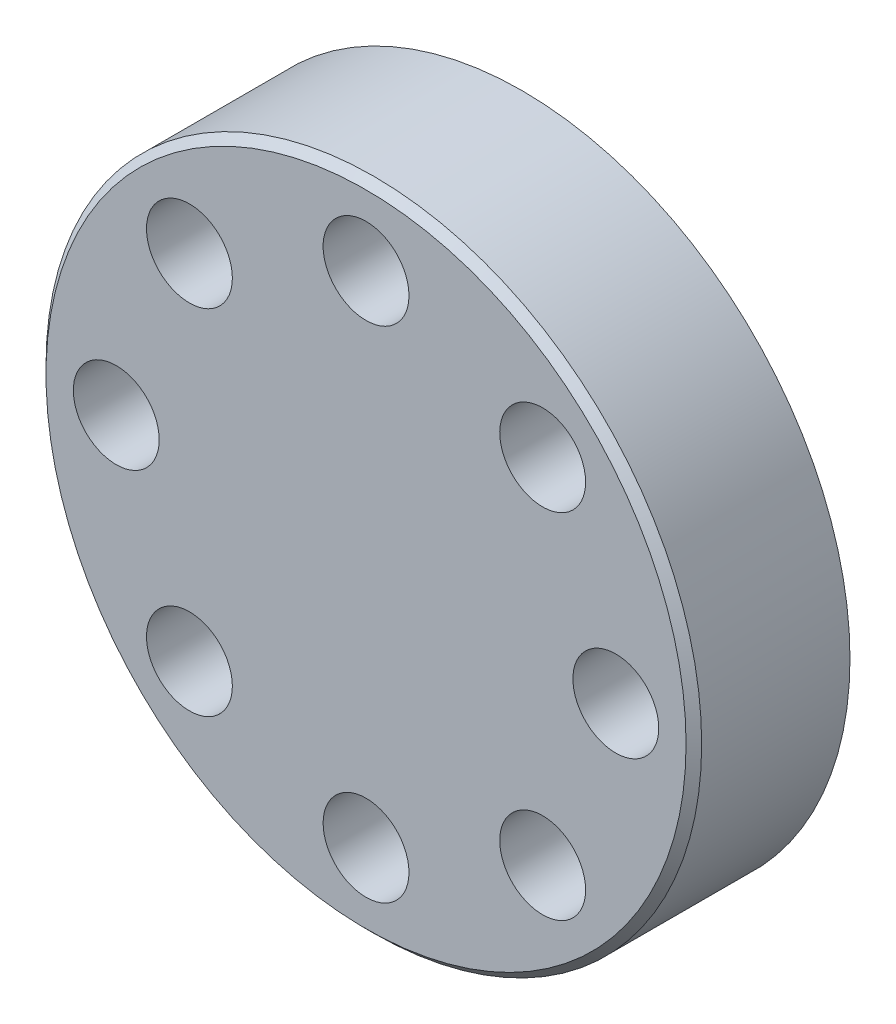
ISO-10303-21;
HEADER;
FILE_DESCRIPTION(('STEP AP214'),'2;1');
FILE_NAME('part.step','',(''),(''),'','','');
FILE_SCHEMA(('AUTOMOTIVE_DESIGN { 1 0 10303 214 1 1 1 1 }'));
ENDSEC;
DATA;
#1=APPLICATION_CONTEXT('core data for automotive mechanical design processes');
#2=APPLICATION_PROTOCOL_DEFINITION('international standard','automotive_design',2000,#1);
#3=PRODUCT_CONTEXT('',#1,'mechanical');
#4=PRODUCT('Part','Part','',(#3));
#5=PRODUCT_RELATED_PRODUCT_CATEGORY('part','',(#4));
#6=PRODUCT_DEFINITION_FORMATION('','',#4);
#7=PRODUCT_DEFINITION_CONTEXT('part definition',#1,'design');
#8=PRODUCT_DEFINITION('design','',#6,#7);
#9=PRODUCT_DEFINITION_SHAPE('','',#8);
#10=(LENGTH_UNIT() NAMED_UNIT(*) SI_UNIT(.MILLI.,.METRE.));
#11=(NAMED_UNIT(*) PLANE_ANGLE_UNIT() SI_UNIT($,.RADIAN.));
#12=(NAMED_UNIT(*) SI_UNIT($,.STERADIAN.) SOLID_ANGLE_UNIT());
#13=UNCERTAINTY_MEASURE_WITH_UNIT(LENGTH_MEASURE(1.E-05),#10,'distance_accuracy_value','');
#14=(GEOMETRIC_REPRESENTATION_CONTEXT(3) GLOBAL_UNCERTAINTY_ASSIGNED_CONTEXT((#13)) GLOBAL_UNIT_ASSIGNED_CONTEXT((#10,
#11,#12)) REPRESENTATION_CONTEXT('',''));
#15=CARTESIAN_POINT('',(0.,0.,0.));
#16=DIRECTION('',(0.,0.,1.));
#17=DIRECTION('',(1.,0.,0.));
#18=AXIS2_PLACEMENT_3D('',#15,#16,#17);
#19=CARTESIAN_POINT('',(0.,0.,8.));
#20=DIRECTION('',(0.,0.,-1.));
#21=DIRECTION('',(-1.,0.,0.));
#22=AXIS2_PLACEMENT_3D('',#19,#20,#21);
#23=CYLINDRICAL_SURFACE('',#22,7.);
#24=CARTESIAN_POINT('',(0.,0.,0.499999999999998));
#25=DIRECTION('',(0.,0.,1.));
#26=DIRECTION('',(1.,0.,0.));
#27=AXIS2_PLACEMENT_3D('',#24,#25,#26);
#28=CIRCLE('',#27,7.);
#29=CARTESIAN_POINT('',(7.,0.,0.499999999999998));
#30=VERTEX_POINT('',#29);
#31=EDGE_CURVE('E52',#30,#30,#28,.T.);
#32=ORIENTED_EDGE('',*,*,#31,.T.);
#33=EDGE_LOOP('',(#32));
#34=FACE_BOUND('',#33,.T.);
#35=CARTESIAN_POINT('',(0.,0.,8.));
#36=DIRECTION('',(0.,0.,1.));
#37=DIRECTION('',(1.,0.,0.));
#38=AXIS2_PLACEMENT_3D('',#35,#36,#37);
#39=CIRCLE('',#38,7.);
#40=CARTESIAN_POINT('',(7.,0.,8.));
#41=VERTEX_POINT('',#40);
#42=EDGE_CURVE('E57',#41,#41,#39,.T.);
#43=ORIENTED_EDGE('',*,*,#42,.F.);
#44=EDGE_LOOP('',(#43));
#45=FACE_BOUND('',#44,.T.);
#46=ADVANCED_FACE('F36',(#34,#45),#23,.T.);
#47=CARTESIAN_POINT('',(0.,0.,0.));
#48=DIRECTION('',(0.,0.,1.));
#49=DIRECTION('',(1.,0.,0.));
#50=AXIS2_PLACEMENT_3D('',#47,#48,#49);
#51=PLANE('',#50);
#52=CARTESIAN_POINT('',(0.,0.,0.));
#53=DIRECTION('',(0.,0.,1.));
#54=DIRECTION('',(1.,0.,0.));
#55=AXIS2_PLACEMENT_3D('',#52,#53,#54);
#56=CIRCLE('',#55,6.5);
#57=CARTESIAN_POINT('',(6.5,0.,0.));
#58=VERTEX_POINT('',#57);
#59=EDGE_CURVE('E48',#58,#58,#56,.F.);
#60=ORIENTED_EDGE('',*,*,#59,.T.);
#61=EDGE_LOOP('',(#60));
#62=FACE_BOUND('',#61,.T.);
#63=ADVANCED_FACE('F143',(#62),#51,.F.);
#64=CARTESIAN_POINT('',(0.,0.,18.));
#65=DIRECTION('',(0.,0.,-1.));
#66=DIRECTION('',(-1.,0.,0.));
#67=AXIS2_PLACEMENT_3D('',#64,#65,#66);
#68=CYLINDRICAL_SURFACE('',#67,21.);
#69=CARTESIAN_POINT('',(0.,0.,17.5));
#70=DIRECTION('',(0.,0.,1.));
#71=DIRECTION('',(1.,0.,0.));
#72=AXIS2_PLACEMENT_3D('',#69,#70,#71);
#73=CIRCLE('',#72,21.);
#74=CARTESIAN_POINT('',(21.,0.,17.5));
#75=VERTEX_POINT('',#74);
#76=EDGE_CURVE('E10',#75,#75,#73,.F.);
#77=ORIENTED_EDGE('',*,*,#76,.T.);
#78=EDGE_LOOP('',(#77));
#79=FACE_BOUND('',#78,.T.);
#80=CARTESIAN_POINT('',(0.,0.,8.));
#81=DIRECTION('',(0.,0.,1.));
#82=DIRECTION('',(1.,0.,0.));
#83=AXIS2_PLACEMENT_3D('',#80,#81,#82);
#84=CIRCLE('',#83,21.);
#85=CARTESIAN_POINT('',(21.,0.,8.));
#86=VERTEX_POINT('',#85);
#87=EDGE_CURVE('E84',#86,#86,#84,.T.);
#88=ORIENTED_EDGE('',*,*,#87,.T.);
#89=EDGE_LOOP('',(#88));
#90=FACE_BOUND('',#89,.T.);
#91=ADVANCED_FACE('F119',(#79,#90),#68,.T.);
#92=CARTESIAN_POINT('',(0.,0.,18.));
#93=DIRECTION('',(0.,0.,1.));
#94=DIRECTION('',(1.,0.,0.));
#95=AXIS2_PLACEMENT_3D('',#92,#93,#94);
#96=PLANE('',#95);
#97=CARTESIAN_POINT('',(0.,0.,18.));
#98=DIRECTION('',(0.,0.,1.));
#99=DIRECTION('',(1.,0.,0.));
#100=AXIS2_PLACEMENT_3D('',#97,#98,#99);
#101=CIRCLE('',#100,20.5);
#102=CARTESIAN_POINT('',(20.5,0.,18.));
#103=VERTEX_POINT('',#102);
#104=EDGE_CURVE('E44',#103,#103,#101,.T.);
#105=ORIENTED_EDGE('',*,*,#104,.T.);
#106=EDGE_LOOP('',(#105));
#107=FACE_BOUND('',#106,.T.);
#108=CARTESIAN_POINT('',(-16.,0.,18.));
#109=DIRECTION('',(0.,0.,1.));
#110=DIRECTION('',(0.,1.,0.));
#111=AXIS2_PLACEMENT_3D('',#108,#109,#110);
#112=CIRCLE('',#111,2.75);
#113=CARTESIAN_POINT('',(-16.,2.74999999999994,18.));
#114=VERTEX_POINT('',#113);
#115=EDGE_CURVE('E93',#114,#114,#112,.T.);
#116=ORIENTED_EDGE('',*,*,#115,.F.);
#117=EDGE_LOOP('',(#116));
#118=FACE_BOUND('',#117,.T.);
#119=CARTESIAN_POINT('',(-11.3137084989847,-11.3137084989848,18.));
#120=DIRECTION('',(0.,0.,1.));
#121=DIRECTION('',(-0.707106781186551,0.707106781186544,0.));
#122=AXIS2_PLACEMENT_3D('',#119,#120,#121);
#123=CIRCLE('',#122,2.75);
#124=CARTESIAN_POINT('',(-13.2582521472477,-9.36916485072182,18.));
#125=VERTEX_POINT('',#124);
#126=EDGE_CURVE('E101',#125,#125,#123,.T.);
#127=ORIENTED_EDGE('',*,*,#126,.F.);
#128=EDGE_LOOP('',(#127));
#129=FACE_BOUND('',#128,.T.);
#130=CARTESIAN_POINT('',(0.,-16.,18.));
#131=DIRECTION('',(0.,0.,1.));
#132=DIRECTION('',(-1.,0.,0.));
#133=AXIS2_PLACEMENT_3D('',#130,#131,#132);
#134=CIRCLE('',#133,2.75);
#135=CARTESIAN_POINT('',(-2.75,-16.,18.));
#136=VERTEX_POINT('',#135);
#137=EDGE_CURVE('E97',#136,#136,#134,.T.);
#138=ORIENTED_EDGE('',*,*,#137,.F.);
#139=EDGE_LOOP('',(#138));
#140=FACE_BOUND('',#139,.T.);
#141=CARTESIAN_POINT('',(11.3137084989849,-11.3137084989847,18.));
#142=DIRECTION('',(0.,0.,1.));
#143=DIRECTION('',(-0.707106781186541,-0.707106781186554,0.));
#144=AXIS2_PLACEMENT_3D('',#141,#142,#143);
#145=CIRCLE('',#144,2.75);
#146=CARTESIAN_POINT('',(9.36916485072187,-13.2582521472477,18.));
#147=VERTEX_POINT('',#146);
#148=EDGE_CURVE('E94',#147,#147,#145,.T.);
#149=ORIENTED_EDGE('',*,*,#148,.F.);
#150=EDGE_LOOP('',(#149));
#151=FACE_BOUND('',#150,.T.);
#152=CARTESIAN_POINT('',(16.,1.6759110426447E-13,18.));
#153=DIRECTION('',(0.,0.,1.));
#154=DIRECTION('',(0.,-1.,0.));
#155=AXIS2_PLACEMENT_3D('',#152,#153,#154);
#156=CIRCLE('',#155,2.75);
#157=CARTESIAN_POINT('',(16.,-2.74999999999983,18.));
#158=VERTEX_POINT('',#157);
#159=EDGE_CURVE('E98',#158,#158,#156,.T.);
#160=ORIENTED_EDGE('',*,*,#159,.F.);
#161=EDGE_LOOP('',(#160));
#162=FACE_BOUND('',#161,.T.);
#163=CARTESIAN_POINT('',(11.3137084989846,11.3137084989849,18.));
#164=DIRECTION('',(0.,0.,1.));
#165=DIRECTION('',(0.707106781186556,-0.707106781186539,0.));
#166=AXIS2_PLACEMENT_3D('',#163,#164,#165);
#167=CIRCLE('',#166,2.75);
#168=CARTESIAN_POINT('',(13.2582521472477,9.36916485072192,18.));
#169=VERTEX_POINT('',#168);
#170=EDGE_CURVE('E106',#169,#169,#167,.T.);
#171=ORIENTED_EDGE('',*,*,#170,.F.);
#172=EDGE_LOOP('',(#171));
#173=FACE_BOUND('',#172,.T.);
#174=CARTESIAN_POINT('',(-11.3137084989848,11.3137084989847,18.));
#175=DIRECTION('',(0.,0.,1.));
#176=DIRECTION('',(0.707106781186546,0.707106781186549,0.));
#177=AXIS2_PLACEMENT_3D('',#174,#175,#176);
#178=CIRCLE('',#177,2.75);
#179=CARTESIAN_POINT('',(-9.36916485072178,13.2582521472478,18.));
#180=VERTEX_POINT('',#179);
#181=EDGE_CURVE('E80',#180,#180,#178,.T.);
#182=ORIENTED_EDGE('',*,*,#181,.F.);
#183=EDGE_LOOP('',(#182));
#184=FACE_BOUND('',#183,.T.);
#185=CARTESIAN_POINT('',(0.,16.,18.));
#186=DIRECTION('',(0.,0.,1.));
#187=DIRECTION('',(1.,0.,0.));
#188=AXIS2_PLACEMENT_3D('',#185,#186,#187);
#189=CIRCLE('',#188,2.75);
#190=CARTESIAN_POINT('',(2.75,16.,18.));
#191=VERTEX_POINT('',#190);
#192=EDGE_CURVE('E61',#191,#191,#189,.T.);
#193=ORIENTED_EDGE('',*,*,#192,.F.);
#194=EDGE_LOOP('',(#193));
#195=FACE_BOUND('',#194,.T.);
#196=ADVANCED_FACE('F115',(#107,#118,#129,#140,#151,#162,#173,#184,#195),#96,.T.);
#197=CARTESIAN_POINT('',(0.,0.,8.));
#198=DIRECTION('',(0.,0.,1.));
#199=DIRECTION('',(1.,0.,0.));
#200=AXIS2_PLACEMENT_3D('',#197,#198,#199);
#201=PLANE('',#200);
#202=CARTESIAN_POINT('',(-16.,0.,8.));
#203=DIRECTION('',(0.,0.,1.));
#204=DIRECTION('',(1.,0.,0.));
#205=AXIS2_PLACEMENT_3D('',#202,#203,#204);
#206=CIRCLE('',#205,2.75);
#207=CARTESIAN_POINT('',(-13.25,0.,8.));
#208=VERTEX_POINT('',#207);
#209=EDGE_CURVE('E58',#208,#208,#206,.T.);
#210=ORIENTED_EDGE('',*,*,#209,.T.);
#211=EDGE_LOOP('',(#210));
#212=FACE_BOUND('',#211,.T.);
#213=CARTESIAN_POINT('',(-11.3137084989847,-11.3137084989848,8.));
#214=DIRECTION('',(0.,0.,1.));
#215=DIRECTION('',(1.,0.,0.));
#216=AXIS2_PLACEMENT_3D('',#213,#214,#215);
#217=CIRCLE('',#216,2.75);
#218=CARTESIAN_POINT('',(-8.5637084989847,-11.3137084989848,8.));
#219=VERTEX_POINT('',#218);
#220=EDGE_CURVE('E62',#219,#219,#217,.T.);
#221=ORIENTED_EDGE('',*,*,#220,.T.);
#222=EDGE_LOOP('',(#221));
#223=FACE_BOUND('',#222,.T.);
#224=CARTESIAN_POINT('',(0.,-16.,8.));
#225=DIRECTION('',(0.,0.,1.));
#226=DIRECTION('',(1.,0.,0.));
#227=AXIS2_PLACEMENT_3D('',#224,#225,#226);
#228=CIRCLE('',#227,2.75);
#229=CARTESIAN_POINT('',(2.75,-16.,8.));
#230=VERTEX_POINT('',#229);
#231=EDGE_CURVE('E65',#230,#230,#228,.T.);
#232=ORIENTED_EDGE('',*,*,#231,.T.);
#233=EDGE_LOOP('',(#232));
#234=FACE_BOUND('',#233,.T.);
#235=CARTESIAN_POINT('',(11.3137084989849,-11.3137084989847,8.));
#236=DIRECTION('',(0.,0.,1.));
#237=DIRECTION('',(1.,0.,0.));
#238=AXIS2_PLACEMENT_3D('',#235,#236,#237);
#239=CIRCLE('',#238,2.75);
#240=CARTESIAN_POINT('',(14.0637084989849,-11.3137084989847,8.));
#241=VERTEX_POINT('',#240);
#242=EDGE_CURVE('E68',#241,#241,#239,.T.);
#243=ORIENTED_EDGE('',*,*,#242,.T.);
#244=EDGE_LOOP('',(#243));
#245=FACE_BOUND('',#244,.T.);
#246=CARTESIAN_POINT('',(16.,1.6759110426447E-13,8.));
#247=DIRECTION('',(0.,0.,1.));
#248=DIRECTION('',(1.,0.,0.));
#249=AXIS2_PLACEMENT_3D('',#246,#247,#248);
#250=CIRCLE('',#249,2.75);
#251=CARTESIAN_POINT('',(18.75,1.6759110426447E-13,8.));
#252=VERTEX_POINT('',#251);
#253=EDGE_CURVE('E71',#252,#252,#250,.T.);
#254=ORIENTED_EDGE('',*,*,#253,.T.);
#255=EDGE_LOOP('',(#254));
#256=FACE_BOUND('',#255,.T.);
#257=CARTESIAN_POINT('',(11.3137084989846,11.3137084989849,8.));
#258=DIRECTION('',(0.,0.,1.));
#259=DIRECTION('',(1.,0.,0.));
#260=AXIS2_PLACEMENT_3D('',#257,#258,#259);
#261=CIRCLE('',#260,2.75);
#262=CARTESIAN_POINT('',(14.0637084989846,11.3137084989849,8.));
#263=VERTEX_POINT('',#262);
#264=EDGE_CURVE('E74',#263,#263,#261,.T.);
#265=ORIENTED_EDGE('',*,*,#264,.T.);
#266=EDGE_LOOP('',(#265));
#267=FACE_BOUND('',#266,.T.);
#268=CARTESIAN_POINT('',(-11.3137084989848,11.3137084989847,8.));
#269=DIRECTION('',(0.,0.,1.));
#270=DIRECTION('',(1.,0.,0.));
#271=AXIS2_PLACEMENT_3D('',#268,#269,#270);
#272=CIRCLE('',#271,2.75);
#273=CARTESIAN_POINT('',(-8.56370849898478,11.3137084989847,8.));
#274=VERTEX_POINT('',#273);
#275=EDGE_CURVE('E77',#274,#274,#272,.T.);
#276=ORIENTED_EDGE('',*,*,#275,.T.);
#277=EDGE_LOOP('',(#276));
#278=FACE_BOUND('',#277,.T.);
#279=CARTESIAN_POINT('',(0.,16.,8.));
#280=DIRECTION('',(0.,0.,1.));
#281=DIRECTION('',(1.,0.,0.));
#282=AXIS2_PLACEMENT_3D('',#279,#280,#281);
#283=CIRCLE('',#282,2.75);
#284=CARTESIAN_POINT('',(2.75,16.,8.));
#285=VERTEX_POINT('',#284);
#286=EDGE_CURVE('E81',#285,#285,#283,.T.);
#287=ORIENTED_EDGE('',*,*,#286,.T.);
#288=EDGE_LOOP('',(#287));
#289=FACE_BOUND('',#288,.T.);
#290=ORIENTED_EDGE('',*,*,#42,.T.);
#291=EDGE_LOOP('',(#290));
#292=FACE_BOUND('',#291,.T.);
#293=ORIENTED_EDGE('',*,*,#87,.F.);
#294=EDGE_LOOP('',(#293));
#295=FACE_BOUND('',#294,.T.);
#296=ADVANCED_FACE('F118',(#212,#223,#234,#245,#256,#267,#278,#289,#292,#295),#201,.F.);
#297=CARTESIAN_POINT('',(0.,16.,0.));
#298=DIRECTION('',(0.,0.,1.));
#299=DIRECTION('',(1.,0.,0.));
#300=AXIS2_PLACEMENT_3D('',#297,#298,#299);
#301=CYLINDRICAL_SURFACE('',#300,2.75);
#302=ORIENTED_EDGE('',*,*,#192,.T.);
#303=EDGE_LOOP('',(#302));
#304=FACE_BOUND('',#303,.T.);
#305=ORIENTED_EDGE('',*,*,#286,.F.);
#306=EDGE_LOOP('',(#305));
#307=FACE_BOUND('',#306,.T.);
#308=ADVANCED_FACE('F127',(#304,#307),#301,.F.);
#309=CARTESIAN_POINT('',(-11.3137084989848,11.3137084989847,0.));
#310=DIRECTION('',(0.,0.,1.));
#311=DIRECTION('',(1.,0.,0.));
#312=AXIS2_PLACEMENT_3D('',#309,#310,#311);
#313=CYLINDRICAL_SURFACE('',#312,2.75);
#314=ORIENTED_EDGE('',*,*,#181,.T.);
#315=EDGE_LOOP('',(#314));
#316=FACE_BOUND('',#315,.T.);
#317=ORIENTED_EDGE('',*,*,#275,.F.);
#318=EDGE_LOOP('',(#317));
#319=FACE_BOUND('',#318,.T.);
#320=ADVANCED_FACE('F130',(#316,#319),#313,.F.);
#321=CARTESIAN_POINT('',(11.3137084989846,11.3137084989849,0.));
#322=DIRECTION('',(0.,0.,1.));
#323=DIRECTION('',(1.,0.,0.));
#324=AXIS2_PLACEMENT_3D('',#321,#322,#323);
#325=CYLINDRICAL_SURFACE('',#324,2.75);
#326=ORIENTED_EDGE('',*,*,#170,.T.);
#327=EDGE_LOOP('',(#326));
#328=FACE_BOUND('',#327,.T.);
#329=ORIENTED_EDGE('',*,*,#264,.F.);
#330=EDGE_LOOP('',(#329));
#331=FACE_BOUND('',#330,.T.);
#332=ADVANCED_FACE('F182',(#328,#331),#325,.F.);
#333=CARTESIAN_POINT('',(16.,1.6759110426447E-13,0.));
#334=DIRECTION('',(0.,0.,1.));
#335=DIRECTION('',(1.,0.,0.));
#336=AXIS2_PLACEMENT_3D('',#333,#334,#335);
#337=CYLINDRICAL_SURFACE('',#336,2.75);
#338=ORIENTED_EDGE('',*,*,#159,.T.);
#339=EDGE_LOOP('',(#338));
#340=FACE_BOUND('',#339,.T.);
#341=ORIENTED_EDGE('',*,*,#253,.F.);
#342=EDGE_LOOP('',(#341));
#343=FACE_BOUND('',#342,.T.);
#344=ADVANCED_FACE('F112',(#340,#343),#337,.F.);
#345=CARTESIAN_POINT('',(11.3137084989849,-11.3137084989847,0.));
#346=DIRECTION('',(0.,0.,1.));
#347=DIRECTION('',(1.,0.,0.));
#348=AXIS2_PLACEMENT_3D('',#345,#346,#347);
#349=CYLINDRICAL_SURFACE('',#348,2.75);
#350=ORIENTED_EDGE('',*,*,#148,.T.);
#351=EDGE_LOOP('',(#350));
#352=FACE_BOUND('',#351,.T.);
#353=ORIENTED_EDGE('',*,*,#242,.F.);
#354=EDGE_LOOP('',(#353));
#355=FACE_BOUND('',#354,.T.);
#356=ADVANCED_FACE('F187',(#352,#355),#349,.F.);
#357=CARTESIAN_POINT('',(0.,-16.,0.));
#358=DIRECTION('',(0.,0.,1.));
#359=DIRECTION('',(1.,0.,0.));
#360=AXIS2_PLACEMENT_3D('',#357,#358,#359);
#361=CYLINDRICAL_SURFACE('',#360,2.75);
#362=ORIENTED_EDGE('',*,*,#137,.T.);
#363=EDGE_LOOP('',(#362));
#364=FACE_BOUND('',#363,.T.);
#365=ORIENTED_EDGE('',*,*,#231,.F.);
#366=EDGE_LOOP('',(#365));
#367=FACE_BOUND('',#366,.T.);
#368=ADVANCED_FACE('F177',(#364,#367),#361,.F.);
#369=CARTESIAN_POINT('',(-11.3137084989847,-11.3137084989848,0.));
#370=DIRECTION('',(0.,0.,1.));
#371=DIRECTION('',(1.,0.,0.));
#372=AXIS2_PLACEMENT_3D('',#369,#370,#371);
#373=CYLINDRICAL_SURFACE('',#372,2.75);
#374=ORIENTED_EDGE('',*,*,#126,.T.);
#375=EDGE_LOOP('',(#374));
#376=FACE_BOUND('',#375,.T.);
#377=ORIENTED_EDGE('',*,*,#220,.F.);
#378=EDGE_LOOP('',(#377));
#379=FACE_BOUND('',#378,.T.);
#380=ADVANCED_FACE('F168',(#376,#379),#373,.F.);
#381=CARTESIAN_POINT('',(-16.,0.,0.));
#382=DIRECTION('',(0.,0.,1.));
#383=DIRECTION('',(1.,0.,0.));
#384=AXIS2_PLACEMENT_3D('',#381,#382,#383);
#385=CYLINDRICAL_SURFACE('',#384,2.75);
#386=ORIENTED_EDGE('',*,*,#115,.T.);
#387=EDGE_LOOP('',(#386));
#388=FACE_BOUND('',#387,.T.);
#389=ORIENTED_EDGE('',*,*,#209,.F.);
#390=EDGE_LOOP('',(#389));
#391=FACE_BOUND('',#390,.T.);
#392=ADVANCED_FACE('F161',(#388,#391),#385,.F.);
#393=CARTESIAN_POINT('',(0.,0.,0.499999999999998));
#394=DIRECTION('',(0.,0.,1.));
#395=DIRECTION('',(1.,0.,0.));
#396=AXIS2_PLACEMENT_3D('',#393,#394,#395);
#397=CONICAL_SURFACE('',#396,7.,0.785398163397452);
#398=ORIENTED_EDGE('',*,*,#59,.F.);
#399=EDGE_LOOP('',(#398));
#400=FACE_BOUND('',#399,.T.);
#401=ORIENTED_EDGE('',*,*,#31,.F.);
#402=EDGE_LOOP('',(#401));
#403=FACE_BOUND('',#402,.T.);
#404=ADVANCED_FACE('F157',(#400,#403),#397,.T.);
#405=CARTESIAN_POINT('',(0.,0.,18.));
#406=DIRECTION('',(0.,0.,-1.));
#407=DIRECTION('',(-1.,0.,0.));
#408=AXIS2_PLACEMENT_3D('',#405,#406,#407);
#409=CONICAL_SURFACE('',#408,20.5,0.785398163397434);
#410=ORIENTED_EDGE('',*,*,#76,.F.);
#411=EDGE_LOOP('',(#410));
#412=FACE_BOUND('',#411,.T.);
#413=ORIENTED_EDGE('',*,*,#104,.F.);
#414=EDGE_LOOP('',(#413));
#415=FACE_BOUND('',#414,.T.);
#416=ADVANCED_FACE('F39',(#412,#415),#409,.T.);
#417=CLOSED_SHELL('',(#46,#63,#91,#196,#296,#308,#320,#332,#344,#356,#368,#380,#392,#404,#416));
#418=MANIFOLD_SOLID_BREP('B2',#417);
#419=ADVANCED_BREP_SHAPE_REPRESENTATION('',(#18,#418),#14);
#420=SHAPE_DEFINITION_REPRESENTATION(#9,#419);
ENDSEC;
END-ISO-10303-21;
